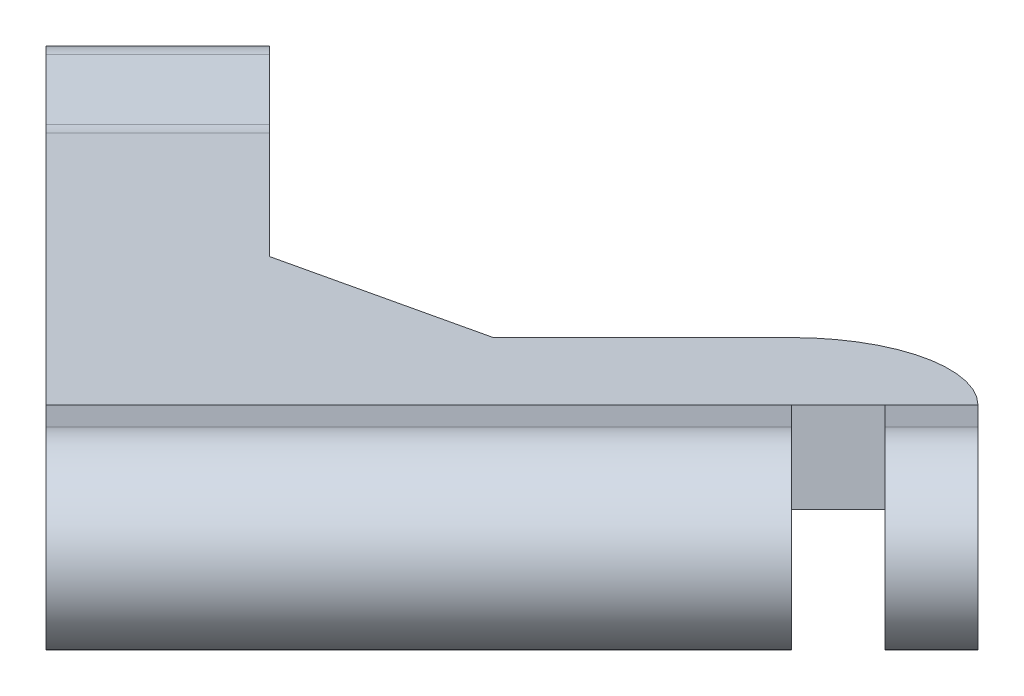
ISO-10303-21;
HEADER;
FILE_DESCRIPTION(('STEP AP214'),'2;1');
FILE_NAME('part.step','',(''),(''),'','','');
FILE_SCHEMA(('AUTOMOTIVE_DESIGN { 1 0 10303 214 1 1 1 1 }'));
ENDSEC;
DATA;
#1=APPLICATION_CONTEXT('core data for automotive mechanical design processes');
#2=APPLICATION_PROTOCOL_DEFINITION('international standard','automotive_design',2000,#1);
#3=PRODUCT_CONTEXT('',#1,'mechanical');
#4=PRODUCT('Part','Part','',(#3));
#5=PRODUCT_RELATED_PRODUCT_CATEGORY('part','',(#4));
#6=PRODUCT_DEFINITION_FORMATION('','',#4);
#7=PRODUCT_DEFINITION_CONTEXT('part definition',#1,'design');
#8=PRODUCT_DEFINITION('design','',#6,#7);
#9=PRODUCT_DEFINITION_SHAPE('','',#8);
#10=(LENGTH_UNIT() NAMED_UNIT(*) SI_UNIT(.MILLI.,.METRE.));
#11=(NAMED_UNIT(*) PLANE_ANGLE_UNIT() SI_UNIT($,.RADIAN.));
#12=(NAMED_UNIT(*) SI_UNIT($,.STERADIAN.) SOLID_ANGLE_UNIT());
#13=UNCERTAINTY_MEASURE_WITH_UNIT(LENGTH_MEASURE(1.E-05),#10,'distance_accuracy_value','');
#14=(GEOMETRIC_REPRESENTATION_CONTEXT(3) GLOBAL_UNCERTAINTY_ASSIGNED_CONTEXT((#13)) GLOBAL_UNIT_ASSIGNED_CONTEXT((#10,
#11,#12)) REPRESENTATION_CONTEXT('',''));
#15=CARTESIAN_POINT('',(0.,0.,0.));
#16=DIRECTION('',(0.,0.,1.));
#17=DIRECTION('',(1.,0.,0.));
#18=AXIS2_PLACEMENT_3D('',#15,#16,#17);
#19=CARTESIAN_POINT('',(7.47352792181047,9.75,60.017683798911));
#20=DIRECTION('',(0.707106781186551,0.,-0.707106781186544));
#21=DIRECTION('',(-0.707106781186544,0.,-0.707106781186551));
#22=AXIS2_PLACEMENT_3D('',#19,#20,#21);
#23=PLANE('',#22);
#24=CARTESIAN_POINT('',(7.47352792181047,9.75,60.017683798911));
#25=DIRECTION('',(0.707106781186551,0.,-0.707106781186544));
#26=DIRECTION('',(-0.707106781186544,0.,-0.707106781186551));
#27=AXIS2_PLACEMENT_3D('',#24,#25,#26);
#28=CIRCLE('',#27,1.20000000000001);
#29=CARTESIAN_POINT('',(6.62499978438661,9.75,59.1691556614871));
#30=VERTEX_POINT('',#29);
#31=EDGE_CURVE('E276',#30,#30,#28,.T.);
#32=ORIENTED_EDGE('',*,*,#31,.F.);
#33=EDGE_LOOP('',(#32));
#34=FACE_BOUND('',#33,.T.);
#35=DIRECTION('',(0.70700675028775,-0.0168199314832323,0.707006750287757));
#36=VECTOR('',#35,1.);
#37=CARTESIAN_POINT('',(-26.1822663292059,7.55025835734501,26.3618895480781));
#38=LINE('',#37,#36);
#39=CARTESIAN_POINT('',(3.61958859566675,6.84126207448712,56.1637444727672));
#40=VERTEX_POINT('',#39);
#41=CARTESIAN_POINT('',(7.43784745899505,6.75042439516078,59.9820033360956));
#42=VERTEX_POINT('',#41);
#43=EDGE_CURVE('E273',#40,#42,#38,.T.);
#44=ORIENTED_EDGE('',*,*,#43,.F.);
#45=DIRECTION('',(-0.171498585142516,0.970142500145329,-0.171498585142518));
#46=VECTOR('',#45,1.);
#47=CARTESIAN_POINT('',(3.36234071795176,8.29647582471199,55.9064965950522));
#48=LINE('',#47,#46);
#49=CARTESIAN_POINT('',(3.1050928401906,9.75168957493467,55.6492487174748));
#50=VERTEX_POINT('',#49);
#51=EDGE_CURVE('E284',#40,#50,#48,.T.);
#52=ORIENTED_EDGE('',*,*,#51,.T.);
#53=DIRECTION('',(0.618232550201715,0.485362779518743,0.618232550201721));
#54=VECTOR('',#53,1.);
#55=CARTESIAN_POINT('',(-22.2776522712156,-10.1758275301328,30.2665036060684));
#56=LINE('',#55,#54);
#57=CARTESIAN_POINT('',(6.44391798351243,12.3729385716022,58.9880738607967));
#58=VERTEX_POINT('',#57);
#59=EDGE_CURVE('E266',#50,#58,#56,.T.);
#60=ORIENTED_EDGE('',*,*,#59,.T.);
#61=CARTESIAN_POINT('',(7.47352792181047,9.75,60.017683798911));
#62=DIRECTION('',(0.707106781186551,0.,-0.707106781186544));
#63=DIRECTION('',(-0.707106781186544,0.,-0.707106781186551));
#64=AXIS2_PLACEMENT_3D('',#61,#62,#63);
#65=CIRCLE('',#64,3.);
#66=EDGE_CURVE('E270',#58,#42,#65,.T.);
#67=ORIENTED_EDGE('',*,*,#66,.T.);
#68=EDGE_LOOP('',(#44,#52,#60,#67));
#69=FACE_BOUND('',#68,.T.);
#70=ADVANCED_FACE('F40',(#34,#69),#23,.T.);
#71=CARTESIAN_POINT('',(-36.1715728752538,0.,36.1715728752534));
#72=DIRECTION('',(0.707106781186551,0.,-0.707106781186544));
#73=DIRECTION('',(-0.707106781186544,0.,-0.707106781186551));
#74=AXIS2_PLACEMENT_3D('',#71,#72,#73);
#75=PLANE('',#74);
#76=CARTESIAN_POINT('',(-23.6391704504667,2.25,48.7039753000407));
#77=DIRECTION('',(0.707106781186551,0.,-0.707106781186544));
#78=DIRECTION('',(-0.707106781186544,0.,-0.707106781186551));
#79=AXIS2_PLACEMENT_3D('',#76,#77,#78);
#80=CIRCLE('',#79,1.2);
#81=CARTESIAN_POINT('',(-24.4876985878906,2.25,47.8554471626168));
#82=VERTEX_POINT('',#81);
#83=EDGE_CURVE('E261',#82,#82,#80,.T.);
#84=ORIENTED_EDGE('',*,*,#83,.F.);
#85=EDGE_LOOP('',(#84));
#86=FACE_BOUND('',#85,.T.);
#87=DIRECTION('',(-0.685994340570032,-0.242535625036333,-0.685994340570039));
#88=VECTOR('',#87,1.);
#89=CARTESIAN_POINT('',(-36.0659712591965,-0.597372950547049,36.2771744913108));
#90=LINE('',#89,#88);
#91=CARTESIAN_POINT('',(-14.3403398426737,7.08379769954436,58.0028059078338));
#92=VERTEX_POINT('',#91);
#93=CARTESIAN_POINT('',(-20.615798453103,4.86508803029933,51.7273472974044));
#94=VERTEX_POINT('',#93);
#95=EDGE_CURVE('E250',#92,#94,#90,.T.);
#96=ORIENTED_EDGE('',*,*,#95,.F.);
#97=DIRECTION('',(0.171498585142508,-0.970142500145332,0.17149858514251));
#98=VECTOR('',#97,1.);
#99=CARTESIAN_POINT('',(-14.445941458731,7.68117065009143,57.8972042917764));
#100=LINE('',#99,#98);
#101=CARTESIAN_POINT('',(-13.8258440872462,4.17337019910837,58.5173016632613));
#102=VERTEX_POINT('',#101);
#103=EDGE_CURVE('E186',#92,#102,#100,.T.);
#104=ORIENTED_EDGE('',*,*,#103,.T.);
#105=DIRECTION('',(-0.685994340570032,-0.242535625036333,-0.685994340570039));
#106=VECTOR('',#105,1.);
#107=CARTESIAN_POINT('',(-35.551475503769,-3.50780045098305,36.7916702467383));
#108=LINE('',#107,#106);
#109=CARTESIAN_POINT('',(-20.8107433257205,1.70383539039338,51.5324024247869));
#110=VERTEX_POINT('',#109);
#111=EDGE_CURVE('E248',#102,#110,#108,.T.);
#112=ORIENTED_EDGE('',*,*,#111,.T.);
#113=DIRECTION('',(-0.655981688195146,-0.373331018675496,-0.655981688195153));
#114=VECTOR('',#113,1.);
#115=CARTESIAN_POINT('',(-34.4479075463554,-6.05732090703683,37.8952382041519));
#116=LINE('',#115,#114);
#117=CARTESIAN_POINT('',(-23.1112006606012,0.394603599772046,49.2319450899061));
#118=VERTEX_POINT('',#117);
#119=EDGE_CURVE('E245',#110,#118,#116,.T.);
#120=ORIENTED_EDGE('',*,*,#119,.T.);
#121=CARTESIAN_POINT('',(-23.6391704504667,2.25,48.7039753000407));
#122=DIRECTION('',(0.707106781186551,0.,-0.707106781186544));
#123=DIRECTION('',(-0.707106781186544,0.,-0.707106781186551));
#124=AXIS2_PLACEMENT_3D('',#121,#122,#123);
#125=CIRCLE('',#124,2.);
#126=CARTESIAN_POINT('',(-23.8245050536997,4.23275116181758,48.5186406968077));
#127=VERTEX_POINT('',#126);
#128=EDGE_CURVE('E258',#118,#127,#125,.T.);
#129=ORIENTED_EDGE('',*,*,#128,.T.);
#130=DIRECTION('',(-0.701008395963355,-0.131051354734543,-0.701008395963362));
#131=VECTOR('',#130,1.);
#132=CARTESIAN_POINT('',(-36.3483734896303,1.89145263458614,35.994772260877));
#133=LINE('',#132,#131);
#134=CARTESIAN_POINT('',(-21.0099548707332,4.75892262648203,51.3331908797743));
#135=VERTEX_POINT('',#134);
#136=EDGE_CURVE('E255',#135,#127,#133,.T.);
#137=ORIENTED_EDGE('',*,*,#136,.F.);
#138=CARTESIAN_POINT('',(-21.4732913788155,9.71580053102599,50.8698543716919));
#139=DIRECTION('',(0.707106781186551,0.,-0.707106781186544));
#140=DIRECTION('',(-0.707106781186544,0.,-0.707106781186551));
#141=AXIS2_PLACEMENT_3D('',#138,#139,#140);
#142=CIRCLE('',#141,5.);
#143=EDGE_CURVE('E252',#94,#135,#142,.T.);
#144=ORIENTED_EDGE('',*,*,#143,.F.);
#145=EDGE_LOOP('',(#96,#104,#112,#120,#129,#137,#144));
#146=FACE_BOUND('',#145,.T.);
#147=ADVANCED_FACE('F327',(#86,#146),#75,.T.);
#148=CARTESIAN_POINT('',(-27.881811137586,2.25,52.94661598716));
#149=DIRECTION('',(0.707106781186551,0.,-0.707106781186544));
#150=DIRECTION('',(-0.707106781186544,0.,-0.707106781186551));
#151=AXIS2_PLACEMENT_3D('',#148,#149,#150);
#152=CYLINDRICAL_SURFACE('',#151,2.);
#153=DIRECTION('',(0.707106781186551,0.,-0.707106781186544));
#154=VECTOR('',#153,1.);
#155=CARTESIAN_POINT('',(-28.067145740819,4.23275116181758,52.761281383927));
#156=LINE('',#155,#154);
#157=CARTESIAN_POINT('',(-28.067145740819,4.23275116181758,52.761281383927));
#158=VERTEX_POINT('',#157);
#159=EDGE_CURVE('E192',#158,#127,#156,.T.);
#160=ORIENTED_EDGE('',*,*,#159,.T.);
#161=ORIENTED_EDGE('',*,*,#128,.F.);
#162=DIRECTION('',(0.707106781186551,0.,-0.707106781186544));
#163=VECTOR('',#162,1.);
#164=CARTESIAN_POINT('',(-27.3538413477206,0.394603599772046,53.4745857770254));
#165=LINE('',#164,#163);
#166=CARTESIAN_POINT('',(-27.3538413477206,0.394603599772046,53.4745857770254));
#167=VERTEX_POINT('',#166);
#168=EDGE_CURVE('E191',#167,#118,#165,.T.);
#169=ORIENTED_EDGE('',*,*,#168,.F.);
#170=CARTESIAN_POINT('',(-27.881811137586,2.25,52.94661598716));
#171=DIRECTION('',(0.707106781186551,0.,-0.707106781186544));
#172=DIRECTION('',(-0.707106781186544,0.,-0.707106781186551));
#173=AXIS2_PLACEMENT_3D('',#170,#171,#172);
#174=CIRCLE('',#173,2.);
#175=EDGE_CURVE('E236',#167,#158,#174,.T.);
#176=ORIENTED_EDGE('',*,*,#175,.T.);
#177=EDGE_LOOP('',(#160,#161,#169,#176));
#178=FACE_BOUND('',#177,.T.);
#179=ADVANCED_FACE('F333',(#178),#152,.T.);
#180=CARTESIAN_POINT('',(-38.6905482334747,-6.05732090703683,42.1378788912711));
#181=DIRECTION('',(0.263984894932724,-0.927698200113979,0.263984894932726));
#182=DIRECTION('',(0.,-0.273693681767347,-0.961816910103287));
#183=AXIS2_PLACEMENT_3D('',#180,#181,#182);
#184=PLANE('',#183);
#185=ORIENTED_EDGE('',*,*,#168,.T.);
#186=ORIENTED_EDGE('',*,*,#119,.F.);
#187=DIRECTION('',(0.707106781186551,0.,-0.707106781186544));
#188=VECTOR('',#187,1.);
#189=CARTESIAN_POINT('',(-25.0533840128398,1.70383539039338,55.7750431119062));
#190=LINE('',#189,#188);
#191=CARTESIAN_POINT('',(-25.0533840128398,1.70383539039338,55.7750431119062));
#192=VERTEX_POINT('',#191);
#193=EDGE_CURVE('E210',#192,#110,#190,.T.);
#194=ORIENTED_EDGE('',*,*,#193,.F.);
#195=DIRECTION('',(-0.655981688195146,-0.373331018675496,-0.655981688195153));
#196=VECTOR('',#195,1.);
#197=CARTESIAN_POINT('',(-38.6905482334747,-6.05732090703683,42.1378788912711));
#198=LINE('',#197,#196);
#199=EDGE_CURVE('E195',#192,#167,#198,.T.);
#200=ORIENTED_EDGE('',*,*,#199,.T.);
#201=EDGE_LOOP('',(#185,#186,#194,#200));
#202=FACE_BOUND('',#201,.T.);
#203=ADVANCED_FACE('F347',(#202),#184,.T.);
#204=CARTESIAN_POINT('',(-39.7941161908883,-3.50780045098305,41.0343109338575));
#205=DIRECTION('',(0.171498585142508,-0.970142500145332,0.17149858514251));
#206=DIRECTION('',(0.,-0.174077655955699,-0.984731927834662));
#207=AXIS2_PLACEMENT_3D('',#204,#205,#206);
#208=PLANE('',#207);
#209=DIRECTION('',(-0.707106781186551,0.,0.707106781186544));
#210=VECTOR('',#209,1.);
#211=CARTESIAN_POINT('',(0.189616892783837,5.62858394933716,52.733772770068));
#212=LINE('',#211,#210);
#213=CARTESIAN_POINT('',(0.189616892854035,5.62858394933716,52.7337727699978));
#214=VERTEX_POINT('',#213);
#215=CARTESIAN_POINT('',(-5.46723735670858,5.62858394933716,58.3906270195604));
#216=VERTEX_POINT('',#215);
#217=EDGE_CURVE('E156',#214,#216,#212,.T.);
#218=ORIENTED_EDGE('',*,*,#217,.F.);
#219=CARTESIAN_POINT('',(3.6195885957061,6.84126207450804,56.1637444728499));
#220=DIRECTION('',(0.171498585142508,-0.970142500145332,0.17149858514251));
#221=DIRECTION('',(0.,-0.174077655955699,-0.984731927834662));
#222=AXIS2_PLACEMENT_3D('',#219,#220,#221);
#223=CIRCLE('',#222,5.);
#224=CARTESIAN_POINT('',(7.15512250156929,6.84126207448983,52.6282105668043));
#225=VERTEX_POINT('',#224);
#226=EDGE_CURVE('E11',#214,#225,#223,.T.);
#227=ORIENTED_EDGE('',*,*,#226,.T.);
#228=DIRECTION('',(-0.707106781186551,0.,0.707106781186544));
#229=VECTOR('',#228,1.);
#230=CARTESIAN_POINT('',(7.15512250156929,6.84126207448983,52.6282105668043));
#231=LINE('',#230,#229);
#232=CARTESIAN_POINT('',(5.38735554863312,6.84126207448712,54.3959775198009));
#233=VERTEX_POINT('',#232);
#234=EDGE_CURVE('E153',#225,#233,#231,.T.);
#235=ORIENTED_EDGE('',*,*,#234,.T.);
#236=DIRECTION('',(-0.707106781186551,0.,0.707106781186544));
#237=VECTOR('',#236,1.);
#238=CARTESIAN_POINT('',(5.38735554863312,6.84126207448712,54.3959775198009));
#239=LINE('',#238,#237);
#240=EDGE_CURVE('E279',#233,#40,#239,.T.);
#241=ORIENTED_EDGE('',*,*,#240,.T.);
#242=DIRECTION('',(0.707106781186551,0.,-0.707106781186544));
#243=VECTOR('',#242,1.);
#244=CARTESIAN_POINT('',(-10.5225470281446,6.84126207449054,70.3058800966015));
#245=LINE('',#244,#243);
#246=CARTESIAN_POINT('',(-10.5225470281446,6.84126207449054,70.3058800966015));
#247=VERTEX_POINT('',#246);
#248=EDGE_CURVE('E207',#247,#40,#245,.T.);
#249=ORIENTED_EDGE('',*,*,#248,.F.);
#250=DIRECTION('',(-0.685994340570032,-0.242535625036333,-0.685994340570039));
#251=VECTOR('',#250,1.);
#252=CARTESIAN_POINT('',(-39.7941161908883,-3.50780045098305,41.0343109338575));
#253=LINE('',#252,#251);
#254=EDGE_CURVE('E216',#247,#192,#253,.T.);
#255=ORIENTED_EDGE('',*,*,#254,.T.);
#256=ORIENTED_EDGE('',*,*,#193,.T.);
#257=ORIENTED_EDGE('',*,*,#111,.F.);
#258=DIRECTION('',(0.985071250072666,0.17149858514251,-0.0149287499273242));
#259=VECTOR('',#258,1.);
#260=CARTESIAN_POINT('',(-5.46723735670668,5.62858394932638,58.3906270195623));
#261=LINE('',#260,#259);
#262=EDGE_CURVE('E179',#102,#216,#261,.T.);
#263=ORIENTED_EDGE('',*,*,#262,.T.);
#264=EDGE_LOOP('',(#218,#227,#235,#241,#249,#255,#256,#257,#263));
#265=FACE_BOUND('',#264,.T.);
#266=ADVANCED_FACE('F152',(#265),#208,.T.);
#267=CARTESIAN_POINT('',(-40.3244019529369,7.55025835734671,40.504025171809));
#268=DIRECTION('',(-0.0118934876108866,-0.999858534946269,-0.0118934876108867));
#269=DIRECTION('',(0.,0.0118943288970687,-0.999929259967968));
#270=AXIS2_PLACEMENT_3D('',#267,#268,#269);
#271=PLANE('',#270);
#272=ORIENTED_EDGE('',*,*,#248,.T.);
#273=ORIENTED_EDGE('',*,*,#43,.T.);
#274=DIRECTION('',(0.707106781186551,0.,-0.707106781186544));
#275=VECTOR('',#274,1.);
#276=CARTESIAN_POINT('',(-6.70428816482242,6.7504243951612,74.1241389599238));
#277=LINE('',#276,#275);
#278=CARTESIAN_POINT('',(-6.70428816482242,6.7504243951612,74.1241389599238));
#279=VERTEX_POINT('',#278);
#280=EDGE_CURVE('E205',#279,#42,#277,.T.);
#281=ORIENTED_EDGE('',*,*,#280,.F.);
#282=DIRECTION('',(-0.70700675028775,0.0168199314832323,-0.707006750287757));
#283=VECTOR('',#282,1.);
#284=CARTESIAN_POINT('',(-40.3244019529369,7.55025835734671,40.504025171809));
#285=LINE('',#284,#283);
#286=EDGE_CURVE('E219',#279,#247,#285,.T.);
#287=ORIENTED_EDGE('',*,*,#286,.T.);
#288=EDGE_LOOP('',(#272,#273,#281,#287));
#289=FACE_BOUND('',#288,.T.);
#290=ADVANCED_FACE('F353',(#289),#271,.T.);
#291=CARTESIAN_POINT('',(-6.66860770198968,9.75,74.1598194227565));
#292=DIRECTION('',(0.707106781186551,0.,-0.707106781186544));
#293=DIRECTION('',(-0.707106781186544,0.,-0.707106781186551));
#294=AXIS2_PLACEMENT_3D('',#291,#292,#293);
#295=CYLINDRICAL_SURFACE('',#294,3.);
#296=ORIENTED_EDGE('',*,*,#280,.T.);
#297=ORIENTED_EDGE('',*,*,#66,.F.);
#298=DIRECTION('',(0.707106781186551,0.,-0.707106781186544));
#299=VECTOR('',#298,1.);
#300=CARTESIAN_POINT('',(-7.69821764018945,12.3729385715873,73.1302094845567));
#301=LINE('',#300,#299);
#302=CARTESIAN_POINT('',(-7.69821764018945,12.3729385715873,73.1302094845567));
#303=VERTEX_POINT('',#302);
#304=EDGE_CURVE('E203',#303,#58,#301,.T.);
#305=ORIENTED_EDGE('',*,*,#304,.F.);
#306=CARTESIAN_POINT('',(-6.66860770198968,9.75,74.1598194227565));
#307=DIRECTION('',(0.707106781186551,0.,-0.707106781186544));
#308=DIRECTION('',(-0.707106781186544,0.,-0.707106781186551));
#309=AXIS2_PLACEMENT_3D('',#306,#307,#308);
#310=CIRCLE('',#309,3.);
#311=EDGE_CURVE('E222',#303,#279,#310,.T.);
#312=ORIENTED_EDGE('',*,*,#311,.T.);
#313=EDGE_LOOP('',(#296,#297,#305,#312));
#314=FACE_BOUND('',#313,.T.);
#315=ADVANCED_FACE('F356',(#314),#295,.T.);
#316=CARTESIAN_POINT('',(-36.4197878949353,-10.1758275301617,44.4086392298106));
#317=DIRECTION('',(0.343203312733252,-0.874312857195775,0.343203312733256));
#318=DIRECTION('',(0.,-0.365397117689668,-0.930851731686676));
#319=AXIS2_PLACEMENT_3D('',#316,#317,#318);
#320=PLANE('',#319);
#321=ORIENTED_EDGE('',*,*,#304,.T.);
#322=ORIENTED_EDGE('',*,*,#59,.F.);
#323=DIRECTION('',(0.707106781186551,0.,-0.707106781186544));
#324=VECTOR('',#323,1.);
#325=CARTESIAN_POINT('',(-11.0370427835722,9.75168957492653,69.791384341174));
#326=LINE('',#325,#324);
#327=CARTESIAN_POINT('',(-11.0370427835722,9.75168957492653,69.791384341174));
#328=VERTEX_POINT('',#327);
#329=EDGE_CURVE('E200',#328,#50,#326,.T.);
#330=ORIENTED_EDGE('',*,*,#329,.F.);
#331=DIRECTION('',(-0.618232550201715,-0.485362779518743,-0.618232550201722));
#332=VECTOR('',#331,1.);
#333=CARTESIAN_POINT('',(-36.4197878949353,-10.1758275301617,44.4086392298106));
#334=LINE('',#333,#332);
#335=EDGE_CURVE('E225',#303,#328,#334,.T.);
#336=ORIENTED_EDGE('',*,*,#335,.F.);
#337=EDGE_LOOP('',(#321,#322,#330,#336));
#338=FACE_BOUND('',#337,.T.);
#339=ADVANCED_FACE('F360',(#338),#320,.F.);
#340=CARTESIAN_POINT('',(-40.3086119463158,-0.597372950547049,40.51981517843));
#341=DIRECTION('',(0.171498585142508,-0.970142500145332,0.17149858514251));
#342=DIRECTION('',(0.,-0.174077655955699,-0.984731927834662));
#343=AXIS2_PLACEMENT_3D('',#340,#341,#342);
#344=PLANE('',#343);
#345=DIRECTION('',(-0.707106781186551,0.,0.707106781186544));
#346=VECTOR('',#345,1.);
#347=CARTESIAN_POINT('',(6.64062674622021,9.75168957495108,52.1137148114552));
#348=LINE('',#347,#346);
#349=CARTESIAN_POINT('',(6.64062674622021,9.75168957495108,52.1137148114552));
#350=VERTEX_POINT('',#349);
#351=CARTESIAN_POINT('',(4.87285979325383,9.75168957495108,53.8814817644216));
#352=VERTEX_POINT('',#351);
#353=EDGE_CURVE('E287',#350,#352,#348,.T.);
#354=ORIENTED_EDGE('',*,*,#353,.F.);
#355=CARTESIAN_POINT('',(3.10509284027858,9.75168957494404,55.6492487174224));
#356=DIRECTION('',(0.171498585142508,-0.970142500145332,0.17149858514251));
#357=DIRECTION('',(0.,-0.174077655955699,-0.984731927834662));
#358=AXIS2_PLACEMENT_3D('',#355,#356,#357);
#359=CIRCLE('',#358,5.);
#360=CARTESIAN_POINT('',(-0.324878862571073,8.53901144975948,52.2192770145727));
#361=VERTEX_POINT('',#360);
#362=EDGE_CURVE('E62',#350,#361,#359,.F.);
#363=ORIENTED_EDGE('',*,*,#362,.T.);
#364=DIRECTION('',(-0.707106781186551,0.,0.707106781186544));
#365=VECTOR('',#364,1.);
#366=CARTESIAN_POINT('',(-0.324878862641268,8.53901144975948,52.2192770146429));
#367=LINE('',#366,#365);
#368=CARTESIAN_POINT('',(-5.98173311213369,8.53901144975948,57.8761312641353));
#369=VERTEX_POINT('',#368);
#370=EDGE_CURVE('E264',#361,#369,#367,.T.);
#371=ORIENTED_EDGE('',*,*,#370,.T.);
#372=DIRECTION('',(-0.985071250072666,-0.17149858514251,0.0149287499273242));
#373=VECTOR('',#372,1.);
#374=CARTESIAN_POINT('',(-40.5795930554002,2.51560549938962,58.4004616606168));
#375=LINE('',#374,#373);
#376=EDGE_CURVE('E182',#369,#92,#375,.T.);
#377=ORIENTED_EDGE('',*,*,#376,.T.);
#378=ORIENTED_EDGE('',*,*,#95,.T.);
#379=DIRECTION('',(0.707106781186551,0.,-0.707106781186544));
#380=VECTOR('',#379,1.);
#381=CARTESIAN_POINT('',(-24.8584391402223,4.86508803029933,55.9699879845237));
#382=LINE('',#381,#380);
#383=CARTESIAN_POINT('',(-24.8584391402223,4.86508803029933,55.9699879845237));
#384=VERTEX_POINT('',#383);
#385=EDGE_CURVE('E197',#384,#94,#382,.T.);
#386=ORIENTED_EDGE('',*,*,#385,.F.);
#387=DIRECTION('',(-0.685994340570032,-0.242535625036333,-0.685994340570039));
#388=VECTOR('',#387,1.);
#389=CARTESIAN_POINT('',(-40.3086119463158,-0.597372950547049,40.51981517843));
#390=LINE('',#389,#388);
#391=EDGE_CURVE('E228',#328,#384,#390,.T.);
#392=ORIENTED_EDGE('',*,*,#391,.F.);
#393=ORIENTED_EDGE('',*,*,#329,.T.);
#394=DIRECTION('',(-0.707106781186551,0.,0.707106781186544));
#395=VECTOR('',#394,1.);
#396=CARTESIAN_POINT('',(4.87285979320068,9.75168957495079,53.8814817643684));
#397=LINE('',#396,#395);
#398=EDGE_CURVE('E280',#352,#50,#397,.T.);
#399=ORIENTED_EDGE('',*,*,#398,.F.);
#400=EDGE_LOOP('',(#354,#363,#371,#377,#378,#386,#392,#393,#399));
#401=FACE_BOUND('',#400,.T.);
#402=ADVANCED_FACE('F364',(#401),#344,.F.);
#403=CARTESIAN_POINT('',(-25.7159320659349,9.71580053102599,55.1124950588111));
#404=DIRECTION('',(0.707106781186551,0.,-0.707106781186544));
#405=DIRECTION('',(-0.707106781186544,0.,-0.707106781186551));
#406=AXIS2_PLACEMENT_3D('',#403,#404,#405);
#407=CYLINDRICAL_SURFACE('',#406,5.);
#408=ORIENTED_EDGE('',*,*,#385,.T.);
#409=ORIENTED_EDGE('',*,*,#143,.T.);
#410=DIRECTION('',(0.707106781186551,0.,-0.707106781186544));
#411=VECTOR('',#410,1.);
#412=CARTESIAN_POINT('',(-25.2525955578525,4.75892262648203,55.5758315668935));
#413=LINE('',#412,#411);
#414=CARTESIAN_POINT('',(-25.2525955578525,4.75892262648203,55.5758315668935));
#415=VERTEX_POINT('',#414);
#416=EDGE_CURVE('E194',#415,#135,#413,.T.);
#417=ORIENTED_EDGE('',*,*,#416,.F.);
#418=CARTESIAN_POINT('',(-25.7159320659349,9.71580053102599,55.1124950588111));
#419=DIRECTION('',(0.707106781186551,0.,-0.707106781186544));
#420=DIRECTION('',(-0.707106781186544,0.,-0.707106781186551));
#421=AXIS2_PLACEMENT_3D('',#418,#419,#420);
#422=CIRCLE('',#421,5.);
#423=EDGE_CURVE('E231',#384,#415,#422,.T.);
#424=ORIENTED_EDGE('',*,*,#423,.F.);
#425=EDGE_LOOP('',(#408,#409,#417,#424));
#426=FACE_BOUND('',#425,.T.);
#427=ADVANCED_FACE('F368',(#426),#407,.F.);
#428=CARTESIAN_POINT('',(-27.881811137586,2.25,52.94661598716));
#429=DIRECTION('',(0.707106781186551,0.,-0.707106781186544));
#430=DIRECTION('',(-0.707106781186544,0.,-0.707106781186551));
#431=AXIS2_PLACEMENT_3D('',#428,#429,#430);
#432=CYLINDRICAL_SURFACE('',#431,1.2);
#433=CARTESIAN_POINT('',(-27.881811137586,2.25,52.94661598716));
#434=DIRECTION('',(0.707106781186551,0.,-0.707106781186544));
#435=DIRECTION('',(-0.707106781186544,0.,-0.707106781186551));
#436=AXIS2_PLACEMENT_3D('',#433,#434,#435);
#437=CIRCLE('',#436,1.2);
#438=CARTESIAN_POINT('',(-28.7303392750099,2.25,52.0980878497361));
#439=VERTEX_POINT('',#438);
#440=EDGE_CURVE('E239',#439,#439,#437,.T.);
#441=ORIENTED_EDGE('',*,*,#440,.F.);
#442=EDGE_LOOP('',(#441));
#443=FACE_BOUND('',#442,.T.);
#444=ORIENTED_EDGE('',*,*,#83,.T.);
#445=EDGE_LOOP('',(#444));
#446=FACE_BOUND('',#445,.T.);
#447=ADVANCED_FACE('F371',(#443,#446),#432,.F.);
#448=CARTESIAN_POINT('',(-6.66860770198968,9.75,74.1598194227565));
#449=DIRECTION('',(0.707106781186551,0.,-0.707106781186544));
#450=DIRECTION('',(-0.707106781186544,0.,-0.707106781186551));
#451=AXIS2_PLACEMENT_3D('',#448,#449,#450);
#452=CYLINDRICAL_SURFACE('',#451,1.20000000000001);
#453=CARTESIAN_POINT('',(-6.66860770198968,9.75,74.1598194227565));
#454=DIRECTION('',(0.707106781186551,0.,-0.707106781186544));
#455=DIRECTION('',(-0.707106781186544,0.,-0.707106781186551));
#456=AXIS2_PLACEMENT_3D('',#453,#454,#455);
#457=CIRCLE('',#456,1.20000000000001);
#458=CARTESIAN_POINT('',(-7.51713583941354,9.75,73.3112912853326));
#459=VERTEX_POINT('',#458);
#460=EDGE_CURVE('E242',#459,#459,#457,.T.);
#461=ORIENTED_EDGE('',*,*,#460,.F.);
#462=EDGE_LOOP('',(#461));
#463=FACE_BOUND('',#462,.T.);
#464=ORIENTED_EDGE('',*,*,#31,.T.);
#465=EDGE_LOOP('',(#464));
#466=FACE_BOUND('',#465,.T.);
#467=ADVANCED_FACE('F375',(#463,#466),#452,.F.);
#468=CARTESIAN_POINT('',(-40.5910141767496,1.89145263458614,40.2374129479963));
#469=DIRECTION('',(0.0926673016164783,-0.99137558090879,0.0926673016164793));
#470=DIRECTION('',(0.,-0.0930677602526339,-0.99565977723395));
#471=AXIS2_PLACEMENT_3D('',#468,#469,#470);
#472=PLANE('',#471);
#473=ORIENTED_EDGE('',*,*,#416,.T.);
#474=ORIENTED_EDGE('',*,*,#136,.T.);
#475=ORIENTED_EDGE('',*,*,#159,.F.);
#476=DIRECTION('',(-0.701008395963355,-0.131051354734543,-0.701008395963362));
#477=VECTOR('',#476,1.);
#478=CARTESIAN_POINT('',(-40.5910141767496,1.89145263458614,40.2374129479963));
#479=LINE('',#478,#477);
#480=EDGE_CURVE('E234',#415,#158,#479,.T.);
#481=ORIENTED_EDGE('',*,*,#480,.F.);
#482=EDGE_LOOP('',(#473,#474,#475,#481));
#483=FACE_BOUND('',#482,.T.);
#484=ADVANCED_FACE('F345',(#483),#472,.F.);
#485=CARTESIAN_POINT('',(-40.4142135623731,0.,40.4142135623727));
#486=DIRECTION('',(0.707106781186551,0.,-0.707106781186544));
#487=DIRECTION('',(-0.707106781186544,0.,-0.707106781186551));
#488=AXIS2_PLACEMENT_3D('',#485,#486,#487);
#489=PLANE('',#488);
#490=ORIENTED_EDGE('',*,*,#460,.T.);
#491=EDGE_LOOP('',(#490));
#492=FACE_BOUND('',#491,.T.);
#493=ORIENTED_EDGE('',*,*,#440,.T.);
#494=EDGE_LOOP('',(#493));
#495=FACE_BOUND('',#494,.T.);
#496=ORIENTED_EDGE('',*,*,#175,.F.);
#497=ORIENTED_EDGE('',*,*,#199,.F.);
#498=ORIENTED_EDGE('',*,*,#254,.F.);
#499=ORIENTED_EDGE('',*,*,#286,.F.);
#500=ORIENTED_EDGE('',*,*,#311,.F.);
#501=ORIENTED_EDGE('',*,*,#335,.T.);
#502=ORIENTED_EDGE('',*,*,#391,.T.);
#503=ORIENTED_EDGE('',*,*,#423,.T.);
#504=ORIENTED_EDGE('',*,*,#480,.T.);
#505=EDGE_LOOP('',(#496,#497,#498,#499,#500,#501,#502,#503,#504));
#506=FACE_BOUND('',#505,.T.);
#507=ADVANCED_FACE('F341',(#492,#495,#506),#489,.F.);
#508=CARTESIAN_POINT('',(-0.430480478699091,9.13638440030944,52.1136753985851));
#509=DIRECTION('',(0.685994340570032,0.242535625036333,0.685994340570039));
#510=DIRECTION('',(0.707106781186551,0.,-0.707106781186544));
#511=AXIS2_PLACEMENT_3D('',#508,#509,#510);
#512=PLANE('',#511);
#513=ORIENTED_EDGE('',*,*,#370,.F.);
#514=DIRECTION('',(-0.171498585142508,0.970142500145332,-0.17149858514251));
#515=VECTOR('',#514,1.);
#516=CARTESIAN_POINT('',(0.189616892856469,5.62858394932338,52.7337727700003));
#517=LINE('',#516,#515);
#518=EDGE_CURVE('E48',#361,#214,#517,.F.);
#519=ORIENTED_EDGE('',*,*,#518,.T.);
#520=ORIENTED_EDGE('',*,*,#217,.T.);
#521=DIRECTION('',(-0.171498585142508,0.970142500145332,-0.17149858514251));
#522=VECTOR('',#521,1.);
#523=CARTESIAN_POINT('',(-6.08733472819151,9.13638440030944,57.7705296480775));
#524=LINE('',#523,#522);
#525=EDGE_CURVE('E188',#216,#369,#524,.T.);
#526=ORIENTED_EDGE('',*,*,#525,.T.);
#527=EDGE_LOOP('',(#513,#519,#520,#526));
#528=FACE_BOUND('',#527,.T.);
#529=ADVANCED_FACE('F322',(#528),#512,.F.);
#530=CARTESIAN_POINT('',(5.13010767091814,8.29647582471199,54.1387296420859));
#531=DIRECTION('',(0.68599434057003,0.242535625036344,0.685994340570037));
#532=DIRECTION('',(0.707106781186551,0.,-0.707106781186544));
#533=AXIS2_PLACEMENT_3D('',#530,#531,#532);
#534=PLANE('',#533);
#535=ORIENTED_EDGE('',*,*,#51,.F.);
#536=ORIENTED_EDGE('',*,*,#240,.F.);
#537=DIRECTION('',(-0.171498585142516,0.970142500145329,-0.171498585142518));
#538=VECTOR('',#537,1.);
#539=CARTESIAN_POINT('',(5.13010767091814,8.29647582471199,54.1387296420859));
#540=LINE('',#539,#538);
#541=EDGE_CURVE('E282',#233,#352,#540,.T.);
#542=ORIENTED_EDGE('',*,*,#541,.T.);
#543=ORIENTED_EDGE('',*,*,#398,.T.);
#544=EDGE_LOOP('',(#535,#536,#542,#543));
#545=FACE_BOUND('',#544,.T.);
#546=ADVANCED_FACE('F313',(#545),#534,.T.);
#547=CARTESIAN_POINT('',(11.0090618277215,9.75,56.4821498929999));
#548=DIRECTION('',(0.707106781186551,0.,-0.707106781186544));
#549=DIRECTION('',(-0.707106781186544,0.,-0.707106781186551));
#550=AXIS2_PLACEMENT_3D('',#547,#548,#549);
#551=PLANE('',#550);
#552=DIRECTION('',(0.70700675028775,-0.0168199314832323,0.707006750287757));
#553=VECTOR('',#552,1.);
#554=CARTESIAN_POINT('',(-22.6467324231812,7.55025835734501,22.8263556420535));
#555=LINE('',#554,#553);
#556=CARTESIAN_POINT('',(10.9733813648492,6.75042439516213,56.4464694301276));
#557=VERTEX_POINT('',#556);
#558=EDGE_CURVE('E163',#225,#557,#555,.T.);
#559=ORIENTED_EDGE('',*,*,#558,.F.);
#560=DIRECTION('',(-0.171498585142508,0.970142500145332,-0.17149858514251));
#561=VECTOR('',#560,1.);
#562=CARTESIAN_POINT('',(6.64062674620941,9.75168957495493,52.1137148114878));
#563=LINE('',#562,#561);
#564=EDGE_CURVE('E173',#225,#350,#563,.T.);
#565=ORIENTED_EDGE('',*,*,#564,.T.);
#566=DIRECTION('',(0.618232550201715,0.485362779518743,0.618232550201722));
#567=VECTOR('',#566,1.);
#568=CARTESIAN_POINT('',(-18.7421183651812,-10.1758275301577,26.7309697000535));
#569=LINE('',#568,#567);
#570=CARTESIAN_POINT('',(9.97945188959022,12.3729385716115,55.4525399548253));
#571=VERTEX_POINT('',#570);
#572=EDGE_CURVE('E167',#350,#571,#569,.T.);
#573=ORIENTED_EDGE('',*,*,#572,.T.);
#574=CARTESIAN_POINT('',(11.0090618277215,9.75,56.4821498929999));
#575=DIRECTION('',(0.707106781186551,0.,-0.707106781186544));
#576=DIRECTION('',(-0.707106781186544,0.,-0.707106781186551));
#577=AXIS2_PLACEMENT_3D('',#574,#575,#576);
#578=CIRCLE('',#577,3.);
#579=EDGE_CURVE('E175',#571,#557,#578,.T.);
#580=ORIENTED_EDGE('',*,*,#579,.T.);
#581=EDGE_LOOP('',(#559,#565,#573,#580));
#582=FACE_BOUND('',#581,.T.);
#583=CARTESIAN_POINT('',(11.0090618277215,9.75,56.4821498929999));
#584=DIRECTION('',(0.707106781186551,0.,-0.707106781186544));
#585=DIRECTION('',(-0.707106781186544,0.,-0.707106781186551));
#586=AXIS2_PLACEMENT_3D('',#583,#584,#585);
#587=CIRCLE('',#586,1.20000000000001);
#588=CARTESIAN_POINT('',(10.1605336902976,9.75,55.633621755576));
#589=VERTEX_POINT('',#588);
#590=EDGE_CURVE('E300',#589,#589,#587,.T.);
#591=ORIENTED_EDGE('',*,*,#590,.F.);
#592=EDGE_LOOP('',(#591));
#593=FACE_BOUND('',#592,.T.);
#594=ADVANCED_FACE('F171',(#582,#593),#551,.T.);
#595=CARTESIAN_POINT('',(9.24129487475511,9.75,58.2499168459663));
#596=DIRECTION('',(0.707106781186551,0.,-0.707106781186544));
#597=DIRECTION('',(-0.707106781186544,0.,-0.707106781186551));
#598=AXIS2_PLACEMENT_3D('',#595,#596,#597);
#599=PLANE('',#598);
#600=ORIENTED_EDGE('',*,*,#541,.F.);
#601=DIRECTION('',(0.70700675028775,-0.0168199314832323,0.707006750287757));
#602=VECTOR('',#601,1.);
#603=CARTESIAN_POINT('',(-24.4144993761476,7.55025835734501,24.5941225950198));
#604=LINE('',#603,#602);
#605=CARTESIAN_POINT('',(9.20561441188284,6.75042439516213,58.214236383094));
#606=VERTEX_POINT('',#605);
#607=EDGE_CURVE('E165',#233,#606,#604,.T.);
#608=ORIENTED_EDGE('',*,*,#607,.T.);
#609=CARTESIAN_POINT('',(9.24129487475511,9.75,58.2499168459663));
#610=DIRECTION('',(0.707106781186551,0.,-0.707106781186544));
#611=DIRECTION('',(-0.707106781186544,0.,-0.707106781186551));
#612=AXIS2_PLACEMENT_3D('',#609,#610,#611);
#613=CIRCLE('',#612,3.);
#614=CARTESIAN_POINT('',(8.21168493662384,12.3729385716115,57.2203069077916));
#615=VERTEX_POINT('',#614);
#616=EDGE_CURVE('E296',#615,#606,#613,.T.);
#617=ORIENTED_EDGE('',*,*,#616,.F.);
#618=DIRECTION('',(0.618232550201715,0.485362779518743,0.618232550201722));
#619=VECTOR('',#618,1.);
#620=CARTESIAN_POINT('',(-20.5098853181476,-10.1758275301577,28.4987366530199));
#621=LINE('',#620,#619);
#622=EDGE_CURVE('E177',#352,#615,#621,.T.);
#623=ORIENTED_EDGE('',*,*,#622,.F.);
#624=EDGE_LOOP('',(#600,#608,#617,#623));
#625=FACE_BOUND('',#624,.T.);
#626=CARTESIAN_POINT('',(9.24129487475511,9.75,58.2499168459663));
#627=DIRECTION('',(0.707106781186551,0.,-0.707106781186544));
#628=DIRECTION('',(-0.707106781186544,0.,-0.707106781186551));
#629=AXIS2_PLACEMENT_3D('',#626,#627,#628);
#630=CIRCLE('',#629,1.20000000000001);
#631=CARTESIAN_POINT('',(8.39276673733125,9.75,57.4013887085424));
#632=VERTEX_POINT('',#631);
#633=EDGE_CURVE('E303',#632,#632,#630,.T.);
#634=ORIENTED_EDGE('',*,*,#633,.T.);
#635=EDGE_LOOP('',(#634));
#636=FACE_BOUND('',#635,.T.);
#637=ADVANCED_FACE('F312',(#625,#636),#599,.F.);
#638=CARTESIAN_POINT('',(-18.7421183651812,-10.1758275301577,26.7309697000535));
#639=DIRECTION('',(0.343203312733252,-0.874312857195775,0.343203312733256));
#640=DIRECTION('',(0.,-0.365397117689668,-0.930851731686676));
#641=AXIS2_PLACEMENT_3D('',#638,#639,#640);
#642=PLANE('',#641);
#643=ORIENTED_EDGE('',*,*,#622,.T.);
#644=DIRECTION('',(-0.707106781186551,0.,0.707106781186544));
#645=VECTOR('',#644,1.);
#646=CARTESIAN_POINT('',(9.97945188959022,12.3729385716115,55.4525399548253));
#647=LINE('',#646,#645);
#648=EDGE_CURVE('E290',#571,#615,#647,.T.);
#649=ORIENTED_EDGE('',*,*,#648,.F.);
#650=ORIENTED_EDGE('',*,*,#572,.F.);
#651=ORIENTED_EDGE('',*,*,#353,.T.);
#652=EDGE_LOOP('',(#643,#649,#650,#651));
#653=FACE_BOUND('',#652,.T.);
#654=ADVANCED_FACE('F319',(#653),#642,.F.);
#655=CARTESIAN_POINT('',(11.0090618277215,9.75,56.4821498929999));
#656=DIRECTION('',(-0.707106781186551,0.,0.707106781186544));
#657=DIRECTION('',(0.707106781186544,0.,0.707106781186551));
#658=AXIS2_PLACEMENT_3D('',#655,#656,#657);
#659=CYLINDRICAL_SURFACE('',#658,3.);
#660=ORIENTED_EDGE('',*,*,#616,.T.);
#661=DIRECTION('',(-0.707106781186551,0.,0.707106781186544));
#662=VECTOR('',#661,1.);
#663=CARTESIAN_POINT('',(10.9733813648492,6.75042439516213,56.4464694301276));
#664=LINE('',#663,#662);
#665=EDGE_CURVE('E166',#557,#606,#664,.T.);
#666=ORIENTED_EDGE('',*,*,#665,.F.);
#667=ORIENTED_EDGE('',*,*,#579,.F.);
#668=ORIENTED_EDGE('',*,*,#648,.T.);
#669=EDGE_LOOP('',(#660,#666,#667,#668));
#670=FACE_BOUND('',#669,.T.);
#671=ADVANCED_FACE('F429',(#670),#659,.T.);
#672=CARTESIAN_POINT('',(-22.6467324231812,7.55025835734501,22.8263556420535));
#673=DIRECTION('',(-0.0118934876108866,-0.999858534946269,-0.0118934876108867));
#674=DIRECTION('',(0.,0.0118943288970687,-0.999929259967968));
#675=AXIS2_PLACEMENT_3D('',#672,#673,#674);
#676=PLANE('',#675);
#677=ORIENTED_EDGE('',*,*,#607,.F.);
#678=ORIENTED_EDGE('',*,*,#234,.F.);
#679=ORIENTED_EDGE('',*,*,#558,.T.);
#680=ORIENTED_EDGE('',*,*,#665,.T.);
#681=EDGE_LOOP('',(#677,#678,#679,#680));
#682=FACE_BOUND('',#681,.T.);
#683=ADVANCED_FACE('F162',(#682),#676,.T.);
#684=CARTESIAN_POINT('',(11.0090618277215,9.75,56.4821498929999));
#685=DIRECTION('',(-0.707106781186551,0.,0.707106781186544));
#686=DIRECTION('',(0.707106781186544,0.,0.707106781186551));
#687=AXIS2_PLACEMENT_3D('',#684,#685,#686);
#688=CYLINDRICAL_SURFACE('',#687,1.20000000000001);
#689=ORIENTED_EDGE('',*,*,#590,.T.);
#690=EDGE_LOOP('',(#689));
#691=FACE_BOUND('',#690,.T.);
#692=ORIENTED_EDGE('',*,*,#633,.F.);
#693=EDGE_LOOP('',(#692));
#694=FACE_BOUND('',#693,.T.);
#695=ADVANCED_FACE('F309',(#691,#694),#688,.F.);
#696=CARTESIAN_POINT('',(-6.08733472819151,9.13638440030944,57.7705296480775));
#697=DIRECTION('',(-0.0149287499273439,0.171498585142508,0.985071250072666));
#698=DIRECTION('',(-0.171498585142508,0.970142500145332,-0.17149858514251));
#699=AXIS2_PLACEMENT_3D('',#696,#697,#698);
#700=PLANE('',#699);
#701=ORIENTED_EDGE('',*,*,#262,.F.);
#702=ORIENTED_EDGE('',*,*,#103,.F.);
#703=ORIENTED_EDGE('',*,*,#376,.F.);
#704=ORIENTED_EDGE('',*,*,#525,.F.);
#705=EDGE_LOOP('',(#701,#702,#703,#704));
#706=FACE_BOUND('',#705,.T.);
#707=ADVANCED_FACE('F386',(#706),#700,.F.);
#708=CARTESIAN_POINT('',(3.362340717991,8.29647582473363,55.9064965951348));
#709=DIRECTION('',(0.171498585142508,-0.970142500145332,0.17149858514251));
#710=DIRECTION('',(0.,-0.174077655955699,-0.984731927834662));
#711=AXIS2_PLACEMENT_3D('',#708,#709,#710);
#712=CYLINDRICAL_SURFACE('',#711,5.);
#713=ORIENTED_EDGE('',*,*,#226,.F.);
#714=ORIENTED_EDGE('',*,*,#518,.F.);
#715=ORIENTED_EDGE('',*,*,#362,.F.);
#716=ORIENTED_EDGE('',*,*,#564,.F.);
#717=EDGE_LOOP('',(#713,#714,#715,#716));
#718=FACE_BOUND('',#717,.T.);
#719=ADVANCED_FACE('F42',(#718),#712,.T.);
#720=CLOSED_SHELL('',(#70,#147,#179,#203,#266,#290,#315,#339,#402,#427,#447,#467,#484,#507,#529,
#546,#594,#637,#654,#671,#683,#695,#707,#719));
#721=MANIFOLD_SOLID_BREP('B2',#720);
#722=ADVANCED_BREP_SHAPE_REPRESENTATION('',(#18,#721),#14);
#723=SHAPE_DEFINITION_REPRESENTATION(#9,#722);
ENDSEC;
END-ISO-10303-21;
